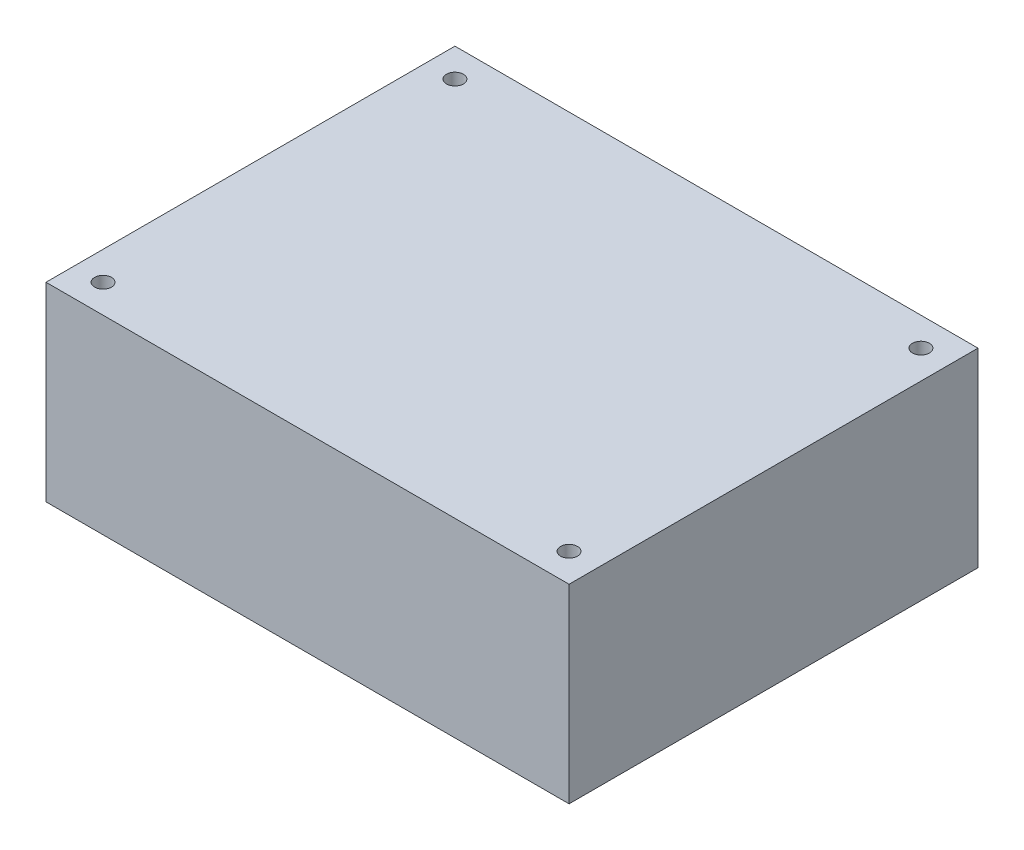
ISO-10303-21;
HEADER;
FILE_DESCRIPTION(('STEP AP214'),'2;1');
FILE_NAME('part.step','',(''),(''),'','','');
FILE_SCHEMA(('AUTOMOTIVE_DESIGN { 1 0 10303 214 1 1 1 1 }'));
ENDSEC;
DATA;
#1=APPLICATION_CONTEXT('core data for automotive mechanical design processes');
#2=APPLICATION_PROTOCOL_DEFINITION('international standard','automotive_design',2000,#1);
#3=PRODUCT_CONTEXT('',#1,'mechanical');
#4=PRODUCT('Part','Part','',(#3));
#5=PRODUCT_RELATED_PRODUCT_CATEGORY('part','',(#4));
#6=PRODUCT_DEFINITION_FORMATION('','',#4);
#7=PRODUCT_DEFINITION_CONTEXT('part definition',#1,'design');
#8=PRODUCT_DEFINITION('design','',#6,#7);
#9=PRODUCT_DEFINITION_SHAPE('','',#8);
#10=(LENGTH_UNIT() NAMED_UNIT(*) SI_UNIT(.MILLI.,.METRE.));
#11=(NAMED_UNIT(*) PLANE_ANGLE_UNIT() SI_UNIT($,.RADIAN.));
#12=(NAMED_UNIT(*) SI_UNIT($,.STERADIAN.) SOLID_ANGLE_UNIT());
#13=UNCERTAINTY_MEASURE_WITH_UNIT(LENGTH_MEASURE(1.E-05),#10,'distance_accuracy_value','');
#14=(GEOMETRIC_REPRESENTATION_CONTEXT(3) GLOBAL_UNCERTAINTY_ASSIGNED_CONTEXT((#13)) GLOBAL_UNIT_ASSIGNED_CONTEXT((#10,
#11,#12)) REPRESENTATION_CONTEXT('',''));
#15=CARTESIAN_POINT('',(0.,0.,0.));
#16=DIRECTION('',(0.,0.,1.));
#17=DIRECTION('',(1.,0.,0.));
#18=AXIS2_PLACEMENT_3D('',#15,#16,#17);
#19=CARTESIAN_POINT('',(34.925,25.4,-27.305));
#20=DIRECTION('',(-1.,0.,0.));
#21=DIRECTION('',(0.,0.,1.));
#22=AXIS2_PLACEMENT_3D('',#19,#20,#21);
#23=PLANE('',#22);
#24=DIRECTION('',(0.,0.,-1.));
#25=VECTOR('',#24,1.);
#26=CARTESIAN_POINT('',(34.925,0.,-27.305));
#27=LINE('',#26,#25);
#28=CARTESIAN_POINT('',(34.925,0.,27.305));
#29=VERTEX_POINT('',#28);
#30=CARTESIAN_POINT('',(34.925,0.,-27.305));
#31=VERTEX_POINT('',#30);
#32=EDGE_CURVE('E96',#29,#31,#27,.T.);
#33=ORIENTED_EDGE('',*,*,#32,.T.);
#34=DIRECTION('',(0.,-1.,0.));
#35=VECTOR('',#34,1.);
#36=CARTESIAN_POINT('',(34.925,25.4,-27.305));
#37=LINE('',#36,#35);
#38=CARTESIAN_POINT('',(34.925,25.4,-27.305));
#39=VERTEX_POINT('',#38);
#40=EDGE_CURVE('E11',#39,#31,#37,.T.);
#41=ORIENTED_EDGE('',*,*,#40,.F.);
#42=DIRECTION('',(0.,0.,-1.));
#43=VECTOR('',#42,1.);
#44=CARTESIAN_POINT('',(34.925,25.4,-27.305));
#45=LINE('',#44,#43);
#46=CARTESIAN_POINT('',(34.925,25.4,27.305));
#47=VERTEX_POINT('',#46);
#48=EDGE_CURVE('E84',#47,#39,#45,.T.);
#49=ORIENTED_EDGE('',*,*,#48,.F.);
#50=DIRECTION('',(0.,-1.,0.));
#51=VECTOR('',#50,1.);
#52=CARTESIAN_POINT('',(34.925,25.4,27.305));
#53=LINE('',#52,#51);
#54=EDGE_CURVE('E92',#47,#29,#53,.T.);
#55=ORIENTED_EDGE('',*,*,#54,.T.);
#56=EDGE_LOOP('',(#33,#41,#49,#55));
#57=FACE_BOUND('',#56,.T.);
#58=ADVANCED_FACE('F33',(#57),#23,.F.);
#59=CARTESIAN_POINT('',(-34.925,25.4,-27.305));
#60=DIRECTION('',(0.,0.,1.));
#61=DIRECTION('',(1.,0.,0.));
#62=AXIS2_PLACEMENT_3D('',#59,#60,#61);
#63=PLANE('',#62);
#64=DIRECTION('',(-1.,0.,0.));
#65=VECTOR('',#64,1.);
#66=CARTESIAN_POINT('',(-34.925,0.,-27.305));
#67=LINE('',#66,#65);
#68=CARTESIAN_POINT('',(-34.925,0.,-27.305));
#69=VERTEX_POINT('',#68);
#70=EDGE_CURVE('E88',#31,#69,#67,.T.);
#71=ORIENTED_EDGE('',*,*,#70,.T.);
#72=DIRECTION('',(0.,-1.,0.));
#73=VECTOR('',#72,1.);
#74=CARTESIAN_POINT('',(-34.925,25.4,-27.305));
#75=LINE('',#74,#73);
#76=CARTESIAN_POINT('',(-34.925,25.4,-27.305));
#77=VERTEX_POINT('',#76);
#78=EDGE_CURVE('E41',#77,#69,#75,.T.);
#79=ORIENTED_EDGE('',*,*,#78,.F.);
#80=DIRECTION('',(-1.,0.,0.));
#81=VECTOR('',#80,1.);
#82=CARTESIAN_POINT('',(-34.925,25.4,-27.305));
#83=LINE('',#82,#81);
#84=EDGE_CURVE('E79',#39,#77,#83,.T.);
#85=ORIENTED_EDGE('',*,*,#84,.F.);
#86=ORIENTED_EDGE('',*,*,#40,.T.);
#87=EDGE_LOOP('',(#71,#79,#85,#86));
#88=FACE_BOUND('',#87,.T.);
#89=ADVANCED_FACE('F87',(#88),#63,.F.);
#90=CARTESIAN_POINT('',(-34.925,25.4,-27.305));
#91=DIRECTION('',(1.,0.,0.));
#92=DIRECTION('',(0.,0.,-1.));
#93=AXIS2_PLACEMENT_3D('',#90,#91,#92);
#94=PLANE('',#93);
#95=DIRECTION('',(0.,0.,1.));
#96=VECTOR('',#95,1.);
#97=CARTESIAN_POINT('',(-34.925,0.,-27.305));
#98=LINE('',#97,#96);
#99=CARTESIAN_POINT('',(-34.925,0.,27.305));
#100=VERTEX_POINT('',#99);
#101=EDGE_CURVE('E66',#69,#100,#98,.T.);
#102=ORIENTED_EDGE('',*,*,#101,.T.);
#103=DIRECTION('',(0.,-1.,0.));
#104=VECTOR('',#103,1.);
#105=CARTESIAN_POINT('',(-34.925,25.4,27.305));
#106=LINE('',#105,#104);
#107=CARTESIAN_POINT('',(-34.925,25.4,27.305));
#108=VERTEX_POINT('',#107);
#109=EDGE_CURVE('E89',#108,#100,#106,.T.);
#110=ORIENTED_EDGE('',*,*,#109,.F.);
#111=DIRECTION('',(0.,0.,1.));
#112=VECTOR('',#111,1.);
#113=CARTESIAN_POINT('',(-34.925,25.4,-27.305));
#114=LINE('',#113,#112);
#115=EDGE_CURVE('E82',#77,#108,#114,.T.);
#116=ORIENTED_EDGE('',*,*,#115,.F.);
#117=ORIENTED_EDGE('',*,*,#78,.T.);
#118=EDGE_LOOP('',(#102,#110,#116,#117));
#119=FACE_BOUND('',#118,.T.);
#120=ADVANCED_FACE('F90',(#119),#94,.F.);
#121=CARTESIAN_POINT('',(-34.925,25.4,27.305));
#122=DIRECTION('',(0.,0.,-1.));
#123=DIRECTION('',(-1.,0.,0.));
#124=AXIS2_PLACEMENT_3D('',#121,#122,#123);
#125=PLANE('',#124);
#126=DIRECTION('',(1.,0.,0.));
#127=VECTOR('',#126,1.);
#128=CARTESIAN_POINT('',(-34.925,0.,27.305));
#129=LINE('',#128,#127);
#130=EDGE_CURVE('E72',#100,#29,#129,.T.);
#131=ORIENTED_EDGE('',*,*,#130,.T.);
#132=ORIENTED_EDGE('',*,*,#54,.F.);
#133=DIRECTION('',(1.,0.,0.));
#134=VECTOR('',#133,1.);
#135=CARTESIAN_POINT('',(-34.925,25.4,27.305));
#136=LINE('',#135,#134);
#137=EDGE_CURVE('E49',#108,#47,#136,.T.);
#138=ORIENTED_EDGE('',*,*,#137,.F.);
#139=ORIENTED_EDGE('',*,*,#109,.T.);
#140=EDGE_LOOP('',(#131,#132,#138,#139));
#141=FACE_BOUND('',#140,.T.);
#142=ADVANCED_FACE('F104',(#141),#125,.F.);
#143=CARTESIAN_POINT('',(0.,25.4,0.));
#144=DIRECTION('',(0.,1.,0.));
#145=DIRECTION('',(0.,0.,1.));
#146=AXIS2_PLACEMENT_3D('',#143,#144,#145);
#147=PLANE('',#146);
#148=CARTESIAN_POINT('',(-31.115,25.4,23.495));
#149=DIRECTION('',(0.,1.,0.));
#150=DIRECTION('',(0.,0.,-1.));
#151=AXIS2_PLACEMENT_3D('',#148,#149,#150);
#152=CIRCLE('',#151,1.1303);
#153=CARTESIAN_POINT('',(-31.115,25.4,22.3647));
#154=VERTEX_POINT('',#153);
#155=EDGE_CURVE('E130',#154,#154,#152,.T.);
#156=ORIENTED_EDGE('',*,*,#155,.F.);
#157=EDGE_LOOP('',(#156));
#158=FACE_BOUND('',#157,.T.);
#159=CARTESIAN_POINT('',(31.115,25.4,23.495));
#160=DIRECTION('',(0.,1.,0.));
#161=DIRECTION('',(0.,0.,1.));
#162=AXIS2_PLACEMENT_3D('',#159,#160,#161);
#163=CIRCLE('',#162,1.1303);
#164=CARTESIAN_POINT('',(31.115,25.4,24.6253));
#165=VERTEX_POINT('',#164);
#166=EDGE_CURVE('E124',#165,#165,#163,.T.);
#167=ORIENTED_EDGE('',*,*,#166,.F.);
#168=EDGE_LOOP('',(#167));
#169=FACE_BOUND('',#168,.T.);
#170=CARTESIAN_POINT('',(31.115,25.4,-23.495));
#171=DIRECTION('',(0.,1.,0.));
#172=DIRECTION('',(0.,0.,-1.));
#173=AXIS2_PLACEMENT_3D('',#170,#171,#172);
#174=CIRCLE('',#173,1.1303);
#175=CARTESIAN_POINT('',(31.115,25.4,-24.6253));
#176=VERTEX_POINT('',#175);
#177=EDGE_CURVE('E118',#176,#176,#174,.T.);
#178=ORIENTED_EDGE('',*,*,#177,.F.);
#179=EDGE_LOOP('',(#178));
#180=FACE_BOUND('',#179,.T.);
#181=CARTESIAN_POINT('',(-31.115,25.4,-23.495));
#182=DIRECTION('',(0.,1.,0.));
#183=DIRECTION('',(0.,0.,1.));
#184=AXIS2_PLACEMENT_3D('',#181,#182,#183);
#185=CIRCLE('',#184,1.1303);
#186=CARTESIAN_POINT('',(-31.115,25.4,-22.3647));
#187=VERTEX_POINT('',#186);
#188=EDGE_CURVE('E112',#187,#187,#185,.T.);
#189=ORIENTED_EDGE('',*,*,#188,.F.);
#190=EDGE_LOOP('',(#189));
#191=FACE_BOUND('',#190,.T.);
#192=ORIENTED_EDGE('',*,*,#48,.T.);
#193=ORIENTED_EDGE('',*,*,#84,.T.);
#194=ORIENTED_EDGE('',*,*,#115,.T.);
#195=ORIENTED_EDGE('',*,*,#137,.T.);
#196=EDGE_LOOP('',(#192,#193,#194,#195));
#197=FACE_BOUND('',#196,.T.);
#198=ADVANCED_FACE('F80',(#158,#169,#180,#191,#197),#147,.T.);
#199=CARTESIAN_POINT('',(0.,0.,0.));
#200=DIRECTION('',(0.,1.,0.));
#201=DIRECTION('',(0.,0.,1.));
#202=AXIS2_PLACEMENT_3D('',#199,#200,#201);
#203=PLANE('',#202);
#204=CARTESIAN_POINT('',(-31.115,0.,23.495));
#205=DIRECTION('',(0.,1.,0.));
#206=DIRECTION('',(0.,0.,1.));
#207=AXIS2_PLACEMENT_3D('',#204,#205,#206);
#208=CIRCLE('',#207,1.1303);
#209=CARTESIAN_POINT('',(-31.115,0.,24.6253));
#210=VERTEX_POINT('',#209);
#211=EDGE_CURVE('E127',#210,#210,#208,.F.);
#212=ORIENTED_EDGE('',*,*,#211,.F.);
#213=EDGE_LOOP('',(#212));
#214=FACE_BOUND('',#213,.T.);
#215=CARTESIAN_POINT('',(31.115,0.,23.495));
#216=DIRECTION('',(0.,1.,0.));
#217=DIRECTION('',(0.,0.,1.));
#218=AXIS2_PLACEMENT_3D('',#215,#216,#217);
#219=CIRCLE('',#218,1.1303);
#220=CARTESIAN_POINT('',(31.115,0.,24.6253));
#221=VERTEX_POINT('',#220);
#222=EDGE_CURVE('E121',#221,#221,#219,.F.);
#223=ORIENTED_EDGE('',*,*,#222,.F.);
#224=EDGE_LOOP('',(#223));
#225=FACE_BOUND('',#224,.T.);
#226=CARTESIAN_POINT('',(31.115,0.,-23.495));
#227=DIRECTION('',(0.,1.,0.));
#228=DIRECTION('',(0.,0.,1.));
#229=AXIS2_PLACEMENT_3D('',#226,#227,#228);
#230=CIRCLE('',#229,1.1303);
#231=CARTESIAN_POINT('',(31.115,0.,-22.3647));
#232=VERTEX_POINT('',#231);
#233=EDGE_CURVE('E115',#232,#232,#230,.F.);
#234=ORIENTED_EDGE('',*,*,#233,.F.);
#235=EDGE_LOOP('',(#234));
#236=FACE_BOUND('',#235,.T.);
#237=CARTESIAN_POINT('',(-31.115,0.,-23.495));
#238=DIRECTION('',(0.,1.,0.));
#239=DIRECTION('',(0.,0.,1.));
#240=AXIS2_PLACEMENT_3D('',#237,#238,#239);
#241=CIRCLE('',#240,1.1303);
#242=CARTESIAN_POINT('',(-31.115,0.,-22.3647));
#243=VERTEX_POINT('',#242);
#244=EDGE_CURVE('E99',#243,#243,#241,.F.);
#245=ORIENTED_EDGE('',*,*,#244,.F.);
#246=EDGE_LOOP('',(#245));
#247=FACE_BOUND('',#246,.T.);
#248=ORIENTED_EDGE('',*,*,#32,.F.);
#249=ORIENTED_EDGE('',*,*,#130,.F.);
#250=ORIENTED_EDGE('',*,*,#101,.F.);
#251=ORIENTED_EDGE('',*,*,#70,.F.);
#252=EDGE_LOOP('',(#248,#249,#250,#251));
#253=FACE_BOUND('',#252,.T.);
#254=ADVANCED_FACE('F107',(#214,#225,#236,#247,#253),#203,.F.);
#255=CARTESIAN_POINT('',(-31.115,-3.19697117910063,-23.495));
#256=DIRECTION('',(0.,1.,0.));
#257=DIRECTION('',(0.,0.,1.));
#258=AXIS2_PLACEMENT_3D('',#255,#256,#257);
#259=CYLINDRICAL_SURFACE('',#258,1.1303);
#260=ORIENTED_EDGE('',*,*,#244,.T.);
#261=EDGE_LOOP('',(#260));
#262=FACE_BOUND('',#261,.T.);
#263=ORIENTED_EDGE('',*,*,#188,.T.);
#264=EDGE_LOOP('',(#263));
#265=FACE_BOUND('',#264,.T.);
#266=ADVANCED_FACE('F145',(#262,#265),#259,.F.);
#267=CARTESIAN_POINT('',(31.115,-3.19697117910063,-23.495));
#268=DIRECTION('',(0.,1.,0.));
#269=DIRECTION('',(0.,0.,1.));
#270=AXIS2_PLACEMENT_3D('',#267,#268,#269);
#271=CYLINDRICAL_SURFACE('',#270,1.1303);
#272=ORIENTED_EDGE('',*,*,#233,.T.);
#273=EDGE_LOOP('',(#272));
#274=FACE_BOUND('',#273,.T.);
#275=ORIENTED_EDGE('',*,*,#177,.T.);
#276=EDGE_LOOP('',(#275));
#277=FACE_BOUND('',#276,.T.);
#278=ADVANCED_FACE('F147',(#274,#277),#271,.F.);
#279=CARTESIAN_POINT('',(31.115,-3.19697117910063,23.495));
#280=DIRECTION('',(0.,1.,0.));
#281=DIRECTION('',(0.,0.,1.));
#282=AXIS2_PLACEMENT_3D('',#279,#280,#281);
#283=CYLINDRICAL_SURFACE('',#282,1.1303);
#284=ORIENTED_EDGE('',*,*,#222,.T.);
#285=EDGE_LOOP('',(#284));
#286=FACE_BOUND('',#285,.T.);
#287=ORIENTED_EDGE('',*,*,#166,.T.);
#288=EDGE_LOOP('',(#287));
#289=FACE_BOUND('',#288,.T.);
#290=ADVANCED_FACE('F154',(#286,#289),#283,.F.);
#291=CARTESIAN_POINT('',(-31.115,-3.19697117910063,23.495));
#292=DIRECTION('',(0.,1.,0.));
#293=DIRECTION('',(0.,0.,1.));
#294=AXIS2_PLACEMENT_3D('',#291,#292,#293);
#295=CYLINDRICAL_SURFACE('',#294,1.1303);
#296=ORIENTED_EDGE('',*,*,#211,.T.);
#297=EDGE_LOOP('',(#296));
#298=FACE_BOUND('',#297,.T.);
#299=ORIENTED_EDGE('',*,*,#155,.T.);
#300=EDGE_LOOP('',(#299));
#301=FACE_BOUND('',#300,.T.);
#302=ADVANCED_FACE('F134',(#298,#301),#295,.F.);
#303=CLOSED_SHELL('',(#58,#89,#120,#142,#198,#254,#266,#278,#290,#302));
#304=MANIFOLD_SOLID_BREP('B2',#303);
#305=ADVANCED_BREP_SHAPE_REPRESENTATION('',(#18,#304),#14);
#306=SHAPE_DEFINITION_REPRESENTATION(#9,#305);
ENDSEC;
END-ISO-10303-21;
